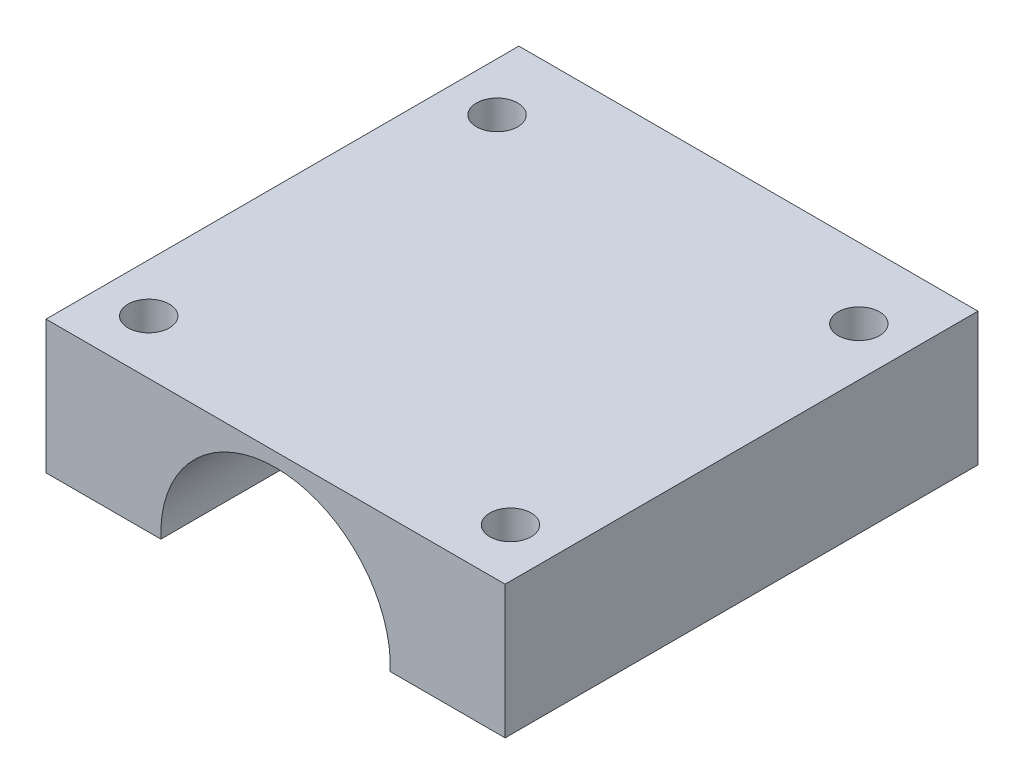
ISO-10303-21;
HEADER;
FILE_DESCRIPTION(('STEP AP214'),'2;1');
FILE_NAME('part.step','',(''),(''),'','','');
FILE_SCHEMA(('AUTOMOTIVE_DESIGN { 1 0 10303 214 1 1 1 1 }'));
ENDSEC;
DATA;
#1=APPLICATION_CONTEXT('core data for automotive mechanical design processes');
#2=APPLICATION_PROTOCOL_DEFINITION('international standard','automotive_design',2000,#1);
#3=PRODUCT_CONTEXT('',#1,'mechanical');
#4=PRODUCT('Part','Part','',(#3));
#5=PRODUCT_RELATED_PRODUCT_CATEGORY('part','',(#4));
#6=PRODUCT_DEFINITION_FORMATION('','',#4);
#7=PRODUCT_DEFINITION_CONTEXT('part definition',#1,'design');
#8=PRODUCT_DEFINITION('design','',#6,#7);
#9=PRODUCT_DEFINITION_SHAPE('','',#8);
#10=(LENGTH_UNIT() NAMED_UNIT(*) SI_UNIT(.MILLI.,.METRE.));
#11=(NAMED_UNIT(*) PLANE_ANGLE_UNIT() SI_UNIT($,.RADIAN.));
#12=(NAMED_UNIT(*) SI_UNIT($,.STERADIAN.) SOLID_ANGLE_UNIT());
#13=UNCERTAINTY_MEASURE_WITH_UNIT(LENGTH_MEASURE(1.E-05),#10,'distance_accuracy_value','');
#14=(GEOMETRIC_REPRESENTATION_CONTEXT(3) GLOBAL_UNCERTAINTY_ASSIGNED_CONTEXT((#13)) GLOBAL_UNIT_ASSIGNED_CONTEXT((#10,
#11,#12)) REPRESENTATION_CONTEXT('',''));
#15=CARTESIAN_POINT('',(0.,0.,0.));
#16=DIRECTION('',(0.,0.,1.));
#17=DIRECTION('',(1.,0.,0.));
#18=AXIS2_PLACEMENT_3D('',#15,#16,#17);
#19=CARTESIAN_POINT('',(0.,-0.500000000000001,0.));
#20=DIRECTION('',(0.,1.,0.));
#21=DIRECTION('',(0.,0.,1.));
#22=AXIS2_PLACEMENT_3D('',#19,#20,#21);
#23=PLANE('',#22);
#24=DIRECTION('',(0.,0.,1.));
#25=VECTOR('',#24,1.);
#26=CARTESIAN_POINT('',(-3.71651718682963,-0.500000000000001,-1.5));
#27=LINE('',#26,#25);
#28=CARTESIAN_POINT('',(-3.71651718682963,-0.500000000000001,-1.5));
#29=VERTEX_POINT('',#28);
#30=CARTESIAN_POINT('',(-3.71651718682963,-0.500000000000001,0.));
#31=VERTEX_POINT('',#30);
#32=EDGE_CURVE('E291',#29,#31,#27,.T.);
#33=ORIENTED_EDGE('',*,*,#32,.T.);
#34=DIRECTION('',(-1.,0.,0.));
#35=VECTOR('',#34,1.);
#36=CARTESIAN_POINT('',(0.,-0.500000000000001,0.));
#37=LINE('',#36,#35);
#38=CARTESIAN_POINT('',(-6.87519231907282,-0.500000000000001,0.));
#39=VERTEX_POINT('',#38);
#40=EDGE_CURVE('E324',#31,#39,#37,.T.);
#41=ORIENTED_EDGE('',*,*,#40,.T.);
#42=DIRECTION('',(0.,0.,-1.));
#43=VECTOR('',#42,1.);
#44=CARTESIAN_POINT('',(-6.87519231907282,-0.500000000000001,-1.5));
#45=LINE('',#44,#43);
#46=CARTESIAN_POINT('',(-6.87519231907282,-0.500000000000001,-0.0499999999999932));
#47=VERTEX_POINT('',#46);
#48=EDGE_CURVE('E283',#47,#39,#45,.F.);
#49=ORIENTED_EDGE('',*,*,#48,.F.);
#50=CARTESIAN_POINT('',(-5.38922670546374,-0.500000000000001,-1.5007));
#51=CARTESIAN_POINT('',(-5.47847927084528,-0.500000000000001,-1.41258268684375));
#52=CARTESIAN_POINT('',(-5.56777555108285,-0.500000000000001,-1.32450958142149));
#53=CARTESIAN_POINT('',(-5.7465567691382,-0.500000000000001,-1.14842874730177));
#54=CARTESIAN_POINT('',(-5.8360417956408,-0.500000000000001,-1.06042110866229));
#55=CARTESIAN_POINT('',(-6.01634200826261,-0.500000000000001,-0.883427900472544));
#56=CARTESIAN_POINT('',(-6.10715934317078,-0.500000000000001,-0.794444517814048));
#57=CARTESIAN_POINT('',(-6.28896658305993,-0.500000000000001,-0.616782123823329));
#58=CARTESIAN_POINT('',(-6.37995632231203,-0.500000000000001,-0.528102942775778));
#59=CARTESIAN_POINT('',(-6.60212243119227,-0.500000000000001,-0.312377836950901));
#60=CARTESIAN_POINT('',(-6.73347357120777,-0.500000000000001,-0.185511133524346));
#61=CARTESIAN_POINT('',(-6.93161704775093,-0.500000000000001,0.00395585415796175));
#62=CARTESIAN_POINT('',(-6.99793523931582,-0.500000000000001,0.0670516174259814));
#63=CARTESIAN_POINT('',(-7.13101886009611,-0.500000000000001,0.192733823428584));
#64=CARTESIAN_POINT('',(-7.19778415949347,-0.500000000000001,0.255320403231186));
#65=CARTESIAN_POINT('',(-7.33131284468334,-0.500000000000001,0.37909119414557));
#66=CARTESIAN_POINT('',(-7.39806897615554,-0.500000000000001,0.440283224264801));
#67=CARTESIAN_POINT('',(-7.53273160091706,-0.500000000000001,0.561546590699582));
#68=CARTESIAN_POINT('',(-7.60063924082482,-0.500000000000001,0.621616667544609));
#69=CARTESIAN_POINT('',(-7.70375302953429,-0.500000000000001,0.709944472184019));
#70=CARTESIAN_POINT('',(-7.73825189096697,-0.500000000000001,0.739025713796864));
#71=CARTESIAN_POINT('',(-7.80789160851985,-0.500000000000001,0.79640671192015));
#72=CARTESIAN_POINT('',(-7.84303239337594,-0.500000000000001,0.824706554313211));
#73=CARTESIAN_POINT('',(-7.91414908366871,-0.500000000000001,0.880113869103118));
#74=CARTESIAN_POINT('',(-7.95012346769481,-0.500000000000001,0.907223286913179));
#75=CARTESIAN_POINT('',(-8.02333412722306,-0.500000000000001,0.959671932878594));
#76=CARTESIAN_POINT('',(-8.060569500165,-0.500000000000001,0.985012389006578));
#77=CARTESIAN_POINT('',(-8.10782476112611,-0.500000000000001,1.01458499857289));
#78=CARTESIAN_POINT('',(-8.1169806942485,-0.500000000000001,1.02019876918069));
#79=CARTESIAN_POINT('',(-8.13540952973909,-0.500000000000001,1.03123390135718));
#80=CARTESIAN_POINT('',(-8.14468244901387,-0.500000000000001,1.03665523467332));
#81=CARTESIAN_POINT('',(-8.17269002648916,-0.500000000000001,1.05259249932407));
#82=CARTESIAN_POINT('',(-8.19161323965308,-0.500000000000001,1.06278152787728));
#83=CARTESIAN_POINT('',(-8.22987811167886,-0.500000000000001,1.08193831860371));
#84=CARTESIAN_POINT('',(-8.2492149613085,-0.500000000000001,1.09091556198756));
#85=CARTESIAN_POINT('',(-8.28850349303215,-0.500000000000001,1.10740198592549));
#86=CARTESIAN_POINT('',(-8.30845503291183,-0.500000000000001,1.11491150314265));
#87=CARTESIAN_POINT('',(-8.35773867967598,-0.500000000000001,1.13087791263133));
#88=CARTESIAN_POINT('',(-8.38740879647834,-0.500000000000001,1.13834899898805));
#89=CARTESIAN_POINT('',(-8.4475355978484,-0.500000000000001,1.14812088531787));
#90=CARTESIAN_POINT('',(-8.47798932895234,-0.500000000000001,1.15043884646649));
#91=CARTESIAN_POINT('',(-8.53886058349151,-0.500000000000001,1.14941920796732));
#92=CARTESIAN_POINT('',(-8.5692778979401,-0.500000000000001,1.14606976810795));
#93=CARTESIAN_POINT('',(-8.62919714185962,-0.500000000000001,1.13442433299227));
#94=CARTESIAN_POINT('',(-8.65869558573092,-0.500000000000001,1.12611146315552));
#95=CARTESIAN_POINT('',(-8.7204442212633,-0.500000000000001,1.10443479541082));
#96=CARTESIAN_POINT('',(-8.7524944145643,-0.500000000000001,1.09052333958103));
#97=CARTESIAN_POINT('',(-8.81510060284621,-0.500000000000001,1.05962271352269));
#98=CARTESIAN_POINT('',(-8.84565335933274,-0.500000000000001,1.04262721686606));
#99=CARTESIAN_POINT('',(-8.90578512666185,-0.500000000000001,1.00650916848476));
#100=CARTESIAN_POINT('',(-8.93535445067873,-0.500000000000001,0.98737076234136));
#101=CARTESIAN_POINT('',(-8.99353840037014,-0.500000000000001,0.947769566969732));
#102=CARTESIAN_POINT('',(-9.0221539354223,-0.500000000000001,0.927308097315916));
#103=CARTESIAN_POINT('',(-9.08156046183026,-0.500000000000001,0.883335760162311));
#104=CARTESIAN_POINT('',(-9.11227781740902,-0.500000000000001,0.85972606872196));
#105=CARTESIAN_POINT('',(-9.1730948502689,-0.500000000000001,0.811721538809686));
#106=CARTESIAN_POINT('',(-9.20319444955723,-0.500000000000001,0.787326602185665));
#107=CARTESIAN_POINT('',(-9.29282928586623,-0.500000000000001,0.713287328203711));
#108=CARTESIAN_POINT('',(-9.3516736339897,-0.500000000000001,0.662809132750884));
#109=CARTESIAN_POINT('',(-9.46836027389012,-0.500000000000001,0.560529249900519));
#110=CARTESIAN_POINT('',(-9.52620073706399,-0.500000000000001,0.50872550167204));
#111=CARTESIAN_POINT('',(-9.64115305259559,-0.500000000000001,0.404347090839906));
#112=CARTESIAN_POINT('',(-9.69826509247083,-0.500000000000001,0.351772634448371));
#113=CARTESIAN_POINT('',(-9.81179063483446,-0.500000000000001,0.24630587664825));
#114=CARTESIAN_POINT('',(-9.86820596480429,-0.500000000000001,0.193415536103337));
#115=CARTESIAN_POINT('',(-9.98069903084663,-0.500000000000001,0.0872700260744862));
#116=CARTESIAN_POINT('',(-10.036776744384,-0.500000000000001,0.0340148327337781));
#117=CARTESIAN_POINT('',(-10.2045431671155,-0.500000000000001,-0.126044011043694));
#118=CARTESIAN_POINT('',(-10.3158637046181,-0.500000000000001,-0.233233225579581));
#119=CARTESIAN_POINT('',(-10.5260818813483,-0.500000000000001,-0.436720609821966));
#120=CARTESIAN_POINT('',(-10.6250368922359,-0.500000000000001,-0.532959692408414));
#121=CARTESIAN_POINT('',(-10.8226683334927,-0.500000000000001,-0.72577716887962));
#122=CARTESIAN_POINT('',(-10.9213446807132,-0.500000000000001,-0.822355647983203));
#123=CARTESIAN_POINT('',(-11.1185808983605,-0.500000000000001,-1.01582008289757));
#124=CARTESIAN_POINT('',(-11.2171405666185,-0.500000000000001,-1.11270624464374));
#125=CARTESIAN_POINT('',(-11.4140750542471,-0.500000000000001,-1.30661096625877));
#126=CARTESIAN_POINT('',(-11.5124499177883,-0.500000000000001,-1.40362948125847));
#127=CARTESIAN_POINT('',(-11.6107732945363,-0.500000000000001,-1.5007));
#128=B_SPLINE_CURVE_WITH_KNOTS('',3,(#50,#51,#52,#53,#54,#55,#56,#57,#58,#59,#60,#61,#62,#63,
#64,#65,#66,#67,#68,#69,#70,#71,#72,#73,#74,#75,#76,#77,#78,#79,#80,#81,#82,#83,#84,#85,#86,#87,
#88,#89,#90,#91,#92,#93,#94,#95,#96,#97,#98,#99,#100,#101,#102,#103,#104,#105,#106,#107,#108,
#109,#110,#111,#112,#113,#114,#115,#116,#117,#118,#119,#120,#121,#122,#123,#124,#125,#126,#127),
.UNSPECIFIED.,.F.,.F.,(4,2,2,2,2,2,2,2,2,2,2,2,2,2,2,2,2,2,2,2,2,2,2,2,2,2,2,2,2,2,2,2,2,2,2,2,
2,2,4),(0.,0.376266083400724,0.752797816982333,1.13423212617476,1.51539888519738,
2.06323784813492,2.33784998470154,2.61238557454853,2.88405554375817,3.15601408700058,
3.29136946520175,3.42670990696061,3.56182024888399,3.69683584793786,3.72905348280828,
3.7612758282884,3.82572145809787,3.88962933224232,3.95352253012226,4.0449438559842,
4.13606026734403,4.22736727226528,4.31898648293016,4.42354924896768,4.52832898510656,
4.63394276355624,4.73945278471841,4.85566161682352,4.9718850313482,5.20443350376504,
5.43736859658582,5.67024246295748,5.90223339727793,6.13423964847816,6.59784710680747,
7.01195578251824,7.42617716261264,7.84079539711024,8.25529709047937),.UNSPECIFIED.);
#129=CARTESIAN_POINT('',(-5.3899356919832,-0.500000000000001,-1.5));
#130=VERTEX_POINT('',#129);
#131=EDGE_CURVE('E269',#130,#47,#128,.T.);
#132=ORIENTED_EDGE('',*,*,#131,.F.);
#133=DIRECTION('',(-1.,0.,0.));
#134=VECTOR('',#133,1.);
#135=CARTESIAN_POINT('',(0.,-0.500000000000001,-1.5));
#136=LINE('',#135,#134);
#137=EDGE_CURVE('E378',#29,#130,#136,.T.);
#138=ORIENTED_EDGE('',*,*,#137,.F.);
#139=EDGE_LOOP('',(#33,#41,#49,#132,#138));
#140=FACE_BOUND('',#139,.T.);
#141=ADVANCED_FACE('F43',(#140),#23,.F.);
#142=CARTESIAN_POINT('',(-19.6986749407734,-0.5,6.17682172326088));
#143=DIRECTION('',(0.,1.,0.));
#144=DIRECTION('',(0.,0.,1.));
#145=AXIS2_PLACEMENT_3D('',#142,#143,#144);
#146=CIRCLE('',#145,2.25);
#147=CARTESIAN_POINT('',(-19.6986749407734,-0.5,8.42682172326087));
#148=VERTEX_POINT('',#147);
#149=EDGE_CURVE('E299',#148,#148,#146,.F.);
#150=ORIENTED_EDGE('',*,*,#149,.F.);
#151=EDGE_LOOP('',(#150));
#152=FACE_BOUND('',#151,.T.);
#153=DIRECTION('',(-1.,0.,0.));
#154=VECTOR('',#153,1.);
#155=CARTESIAN_POINT('',(0.,-0.500000000000001,50.));
#156=LINE('',#155,#154);
#157=CARTESIAN_POINT('',(-12.4899959967968,-0.500000000000001,50.));
#158=VERTEX_POINT('',#157);
#159=CARTESIAN_POINT('',(-25.,-0.500000000000001,50.));
#160=VERTEX_POINT('',#159);
#161=EDGE_CURVE('E279',#158,#160,#156,.T.);
#162=ORIENTED_EDGE('',*,*,#161,.T.);
#163=DIRECTION('',(0.,0.,-1.));
#164=VECTOR('',#163,1.);
#165=CARTESIAN_POINT('',(-25.,-0.500000000000001,50.));
#166=LINE('',#165,#164);
#167=CARTESIAN_POINT('',(-25.,-0.500000000000001,-1.5));
#168=VERTEX_POINT('',#167);
#169=EDGE_CURVE('E11',#160,#168,#166,.T.);
#170=ORIENTED_EDGE('',*,*,#169,.T.);
#171=CARTESIAN_POINT('',(-11.6100643080168,-0.500000000000001,-1.5));
#172=VERTEX_POINT('',#171);
#173=EDGE_CURVE('E62',#172,#168,#136,.T.);
#174=ORIENTED_EDGE('',*,*,#173,.F.);
#175=CARTESIAN_POINT('',(-10.1248076809272,-0.500000000000001,-0.0499999999999932));
#176=VERTEX_POINT('',#175);
#177=EDGE_CURVE('E278',#176,#172,#128,.T.);
#178=ORIENTED_EDGE('',*,*,#177,.F.);
#179=DIRECTION('',(0.,0.,-1.));
#180=VECTOR('',#179,1.);
#181=CARTESIAN_POINT('',(-10.1248076809272,-0.500000000000001,-1.5));
#182=LINE('',#181,#180);
#183=CARTESIAN_POINT('',(-10.1248076809272,-0.500000000000001,0.));
#184=VERTEX_POINT('',#183);
#185=EDGE_CURVE('E277',#184,#176,#182,.T.);
#186=ORIENTED_EDGE('',*,*,#185,.F.);
#187=CARTESIAN_POINT('',(-12.4899959967968,-0.500000000000001,0.));
#188=VERTEX_POINT('',#187);
#189=EDGE_CURVE('E295',#184,#188,#37,.T.);
#190=ORIENTED_EDGE('',*,*,#189,.T.);
#191=DIRECTION('',(0.,0.,-1.));
#192=VECTOR('',#191,1.);
#193=CARTESIAN_POINT('',(-12.4899959967968,-0.500000000000001,50.));
#194=LINE('',#193,#192);
#195=EDGE_CURVE('E284',#188,#158,#194,.F.);
#196=ORIENTED_EDGE('',*,*,#195,.T.);
#197=EDGE_LOOP('',(#162,#170,#174,#178,#186,#190,#196));
#198=FACE_BOUND('',#197,.T.);
#199=CARTESIAN_POINT('',(-19.6986749407734,-0.5,44.1150104980837));
#200=DIRECTION('',(0.,1.,0.));
#201=DIRECTION('',(0.,0.,1.));
#202=AXIS2_PLACEMENT_3D('',#199,#200,#201);
#203=CIRCLE('',#202,2.25);
#204=CARTESIAN_POINT('',(-19.6986749407734,-0.5,46.3650104980837));
#205=VERTEX_POINT('',#204);
#206=EDGE_CURVE('E302',#205,#205,#203,.F.);
#207=ORIENTED_EDGE('',*,*,#206,.F.);
#208=EDGE_LOOP('',(#207));
#209=FACE_BOUND('',#208,.T.);
#210=ADVANCED_FACE('F389',(#152,#198,#209),#23,.F.);
#211=CARTESIAN_POINT('',(19.6986749407734,-0.5,6.17682172326088));
#212=DIRECTION('',(0.,1.,0.));
#213=DIRECTION('',(0.,0.,1.));
#214=AXIS2_PLACEMENT_3D('',#211,#212,#213);
#215=CIRCLE('',#214,2.25);
#216=CARTESIAN_POINT('',(19.6986749407734,-0.5,8.42682172326087));
#217=VERTEX_POINT('',#216);
#218=EDGE_CURVE('E172',#217,#217,#215,.F.);
#219=ORIENTED_EDGE('',*,*,#218,.F.);
#220=EDGE_LOOP('',(#219));
#221=FACE_BOUND('',#220,.T.);
#222=CARTESIAN_POINT('',(25.,-0.499999999999995,50.));
#223=VERTEX_POINT('',#222);
#224=CARTESIAN_POINT('',(12.4899959967968,-0.500000000000001,50.));
#225=VERTEX_POINT('',#224);
#226=EDGE_CURVE('E287',#223,#225,#156,.T.);
#227=ORIENTED_EDGE('',*,*,#226,.T.);
#228=DIRECTION('',(0.,0.,-1.));
#229=VECTOR('',#228,1.);
#230=CARTESIAN_POINT('',(12.4899959967968,-0.500000000000001,50.));
#231=LINE('',#230,#229);
#232=CARTESIAN_POINT('',(12.4899959967968,-0.500000000000001,0.));
#233=VERTEX_POINT('',#232);
#234=EDGE_CURVE('E288',#225,#233,#231,.T.);
#235=ORIENTED_EDGE('',*,*,#234,.T.);
#236=CARTESIAN_POINT('',(10.1248076809272,-0.500000000000001,0.));
#237=VERTEX_POINT('',#236);
#238=EDGE_CURVE('E325',#233,#237,#37,.T.);
#239=ORIENTED_EDGE('',*,*,#238,.T.);
#240=DIRECTION('',(0.,0.,-1.));
#241=VECTOR('',#240,1.);
#242=CARTESIAN_POINT('',(10.1248076809272,-0.500000000000001,-1.5));
#243=LINE('',#242,#241);
#244=CARTESIAN_POINT('',(10.1248076809272,-0.500000000000001,-0.0499999999999932));
#245=VERTEX_POINT('',#244);
#246=EDGE_CURVE('E316',#245,#237,#243,.F.);
#247=ORIENTED_EDGE('',*,*,#246,.F.);
#248=CARTESIAN_POINT('',(11.6107732945363,-0.500000000000001,-1.5007));
#249=CARTESIAN_POINT('',(11.5215207291547,-0.500000000000001,-1.41258268684375));
#250=CARTESIAN_POINT('',(11.4322244489172,-0.500000000000001,-1.32450958142149));
#251=CARTESIAN_POINT('',(11.2534432308618,-0.500000000000001,-1.14842874730178));
#252=CARTESIAN_POINT('',(11.1639582043592,-0.500000000000001,-1.06042110866229));
#253=CARTESIAN_POINT('',(10.9836579917374,-0.500000000000001,-0.883427900472545));
#254=CARTESIAN_POINT('',(10.8928406568292,-0.500000000000001,-0.794444517814049));
#255=CARTESIAN_POINT('',(10.7110334169401,-0.500000000000001,-0.61678212382333));
#256=CARTESIAN_POINT('',(10.620043677688,-0.500000000000001,-0.528102942775779));
#257=CARTESIAN_POINT('',(10.3978775688077,-0.500000000000001,-0.312377836950902));
#258=CARTESIAN_POINT('',(10.2665264287922,-0.500000000000001,-0.185511133524348));
#259=CARTESIAN_POINT('',(10.0683829522491,-0.500000000000001,0.00395585415796061));
#260=CARTESIAN_POINT('',(10.0020647606842,-0.500000000000001,0.0670516174259805));
#261=CARTESIAN_POINT('',(9.8689811399039,-0.500000000000001,0.192733823428583));
#262=CARTESIAN_POINT('',(9.80221584050653,-0.500000000000001,0.255320403231184));
#263=CARTESIAN_POINT('',(9.66868715531666,-0.500000000000001,0.379091194145568));
#264=CARTESIAN_POINT('',(9.60193102384446,-0.500000000000001,0.440283224264799));
#265=CARTESIAN_POINT('',(9.46726839908294,-0.500000000000001,0.561546590699581));
#266=CARTESIAN_POINT('',(9.39936075917518,-0.500000000000001,0.621616667544608));
#267=CARTESIAN_POINT('',(9.29624697046572,-0.500000000000001,0.709944472184019));
#268=CARTESIAN_POINT('',(9.26174810903303,-0.500000000000001,0.739025713796863));
#269=CARTESIAN_POINT('',(9.19210839148015,-0.500000000000001,0.79640671192015));
#270=CARTESIAN_POINT('',(9.15696760662406,-0.500000000000001,0.824706554313211));
#271=CARTESIAN_POINT('',(9.08585091633129,-0.500000000000001,0.880113869103118));
#272=CARTESIAN_POINT('',(9.04987653230519,-0.500000000000001,0.907223286913179));
#273=CARTESIAN_POINT('',(8.97666587277694,-0.500000000000001,0.959671932878594));
#274=CARTESIAN_POINT('',(8.939430499835,-0.500000000000001,0.985012389006578));
#275=CARTESIAN_POINT('',(8.89217523887389,-0.500000000000001,1.01458499857289));
#276=CARTESIAN_POINT('',(8.8830193057515,-0.500000000000001,1.02019876918069));
#277=CARTESIAN_POINT('',(8.86459047026091,-0.500000000000001,1.03123390135718));
#278=CARTESIAN_POINT('',(8.85531755098613,-0.500000000000001,1.03665523467332));
#279=CARTESIAN_POINT('',(8.82730997351084,-0.500000000000001,1.05259249932407));
#280=CARTESIAN_POINT('',(8.80838676034692,-0.500000000000001,1.06278152787728));
#281=CARTESIAN_POINT('',(8.77012188832114,-0.500000000000001,1.08193831860371));
#282=CARTESIAN_POINT('',(8.75078503869151,-0.500000000000001,1.09091556198756));
#283=CARTESIAN_POINT('',(8.71149650696785,-0.500000000000001,1.10740198592549));
#284=CARTESIAN_POINT('',(8.69154496708817,-0.500000000000001,1.11491150314265));
#285=CARTESIAN_POINT('',(8.64226132032403,-0.500000000000001,1.13087791263133));
#286=CARTESIAN_POINT('',(8.61259120352166,-0.500000000000001,1.13834899898805));
#287=CARTESIAN_POINT('',(8.5524644021516,-0.500000000000001,1.14812088531787));
#288=CARTESIAN_POINT('',(8.52201067104766,-0.500000000000001,1.15043884646649));
#289=CARTESIAN_POINT('',(8.46113941650849,-0.500000000000001,1.14941920796732));
#290=CARTESIAN_POINT('',(8.4307221020599,-0.500000000000001,1.14606976810795));
#291=CARTESIAN_POINT('',(8.37080285814038,-0.500000000000001,1.13442433299227));
#292=CARTESIAN_POINT('',(8.34130441426909,-0.500000000000001,1.12611146315552));
#293=CARTESIAN_POINT('',(8.2795557787367,-0.500000000000001,1.10443479541082));
#294=CARTESIAN_POINT('',(8.2475055854357,-0.500000000000001,1.09052333958103));
#295=CARTESIAN_POINT('',(8.18489939715379,-0.500000000000001,1.05962271352269));
#296=CARTESIAN_POINT('',(8.15434664066727,-0.500000000000001,1.04262721686606));
#297=CARTESIAN_POINT('',(8.09421487333815,-0.500000000000001,1.00650916848476));
#298=CARTESIAN_POINT('',(8.06464554932127,-0.500000000000001,0.987370762341361));
#299=CARTESIAN_POINT('',(8.00646159962986,-0.500000000000001,0.947769566969733));
#300=CARTESIAN_POINT('',(7.9778460645777,-0.500000000000001,0.927308097315916));
#301=CARTESIAN_POINT('',(7.91843953816974,-0.500000000000001,0.883335760162311));
#302=CARTESIAN_POINT('',(7.88772218259098,-0.500000000000001,0.859726068721961));
#303=CARTESIAN_POINT('',(7.8269051497311,-0.500000000000001,0.811721538809688));
#304=CARTESIAN_POINT('',(7.79680555044278,-0.500000000000001,0.787326602185666));
#305=CARTESIAN_POINT('',(7.70717071413377,-0.500000000000001,0.713287328203712));
#306=CARTESIAN_POINT('',(7.6483263660103,-0.500000000000001,0.662809132750885));
#307=CARTESIAN_POINT('',(7.53163972610988,-0.500000000000001,0.56052924990052));
#308=CARTESIAN_POINT('',(7.47379926293601,-0.500000000000001,0.508725501672041));
#309=CARTESIAN_POINT('',(7.35884694740441,-0.500000000000001,0.404347090839906));
#310=CARTESIAN_POINT('',(7.30173490752917,-0.500000000000001,0.351772634448371));
#311=CARTESIAN_POINT('',(7.18820936516554,-0.500000000000001,0.24630587664825));
#312=CARTESIAN_POINT('',(7.13179403519571,-0.500000000000001,0.193415536103337));
#313=CARTESIAN_POINT('',(7.01930096915337,-0.500000000000001,0.0872700260744855));
#314=CARTESIAN_POINT('',(6.96322325561595,-0.500000000000001,0.0340148327337778));
#315=CARTESIAN_POINT('',(6.79545683288447,-0.500000000000001,-0.126044011043694));
#316=CARTESIAN_POINT('',(6.68413629538186,-0.500000000000001,-0.233233225579581));
#317=CARTESIAN_POINT('',(6.47391811865172,-0.500000000000001,-0.436720609821967));
#318=CARTESIAN_POINT('',(6.37496310776409,-0.500000000000001,-0.532959692408414));
#319=CARTESIAN_POINT('',(6.17733166650731,-0.500000000000001,-0.725777168879621));
#320=CARTESIAN_POINT('',(6.0786553192868,-0.500000000000001,-0.822355647983204));
#321=CARTESIAN_POINT('',(5.88141910163955,-0.500000000000001,-1.01582008289756));
#322=CARTESIAN_POINT('',(5.78285943338155,-0.500000000000001,-1.11270624464374));
#323=CARTESIAN_POINT('',(5.58592494575293,-0.500000000000001,-1.30661096625877));
#324=CARTESIAN_POINT('',(5.48755008221173,-0.500000000000001,-1.40362948125847));
#325=CARTESIAN_POINT('',(5.38922670546374,-0.500000000000001,-1.5007));
#326=B_SPLINE_CURVE_WITH_KNOTS('',3,(#248,#249,#250,#251,#252,#253,#254,#255,#256,#257,#258,
#259,#260,#261,#262,#263,#264,#265,#266,#267,#268,#269,#270,#271,#272,#273,#274,#275,#276,#277,
#278,#279,#280,#281,#282,#283,#284,#285,#286,#287,#288,#289,#290,#291,#292,#293,#294,#295,#296,
#297,#298,#299,#300,#301,#302,#303,#304,#305,#306,#307,#308,#309,#310,#311,#312,#313,#314,#315,
#316,#317,#318,#319,#320,#321,#322,#323,#324,#325),.UNSPECIFIED.,.F.,.F.,(4,2,2,2,2,2,2,2,2,2,2,
2,2,2,2,2,2,2,2,2,2,2,2,2,2,2,2,2,2,2,2,2,2,2,2,2,2,2,4),(0.,0.376266083400723,
0.752797816982332,1.13423212617476,1.51539888519738,2.06323784813492,2.33784998470154,
2.61238557454853,2.88405554375817,3.15601408700058,3.29136946520175,3.42670990696061,
3.56182024888399,3.69683584793786,3.72905348280829,3.7612758282884,3.82572145809787,
3.88962933224232,3.95352253012226,4.04494385598419,4.13606026734403,4.22736727226528,
4.31898648293016,4.42354924896769,4.52832898510655,4.63394276355624,4.73945278471841,
4.85566161682352,4.9718850313482,5.20443350376504,5.43736859658582,5.67024246295748,
5.90223339727794,6.13423964847816,6.59784710680747,7.01195578251825,7.42617716261264,
7.84079539711024,8.25529709047937),.UNSPECIFIED.);
#327=CARTESIAN_POINT('',(11.6100643080168,-0.500000000000001,-1.5));
#328=VERTEX_POINT('',#327);
#329=EDGE_CURVE('E168',#328,#245,#326,.T.);
#330=ORIENTED_EDGE('',*,*,#329,.F.);
#331=CARTESIAN_POINT('',(25.,-0.499999999999995,-1.5));
#332=VERTEX_POINT('',#331);
#333=EDGE_CURVE('E164',#332,#328,#136,.T.);
#334=ORIENTED_EDGE('',*,*,#333,.F.);
#335=DIRECTION('',(0.,0.,-1.));
#336=VECTOR('',#335,1.);
#337=CARTESIAN_POINT('',(25.,-0.499999999999995,50.));
#338=LINE('',#337,#336);
#339=EDGE_CURVE('E149',#223,#332,#338,.T.);
#340=ORIENTED_EDGE('',*,*,#339,.F.);
#341=EDGE_LOOP('',(#227,#235,#239,#247,#330,#334,#340));
#342=FACE_BOUND('',#341,.T.);
#343=CARTESIAN_POINT('',(19.6986749407734,-0.5,44.1150104980837));
#344=DIRECTION('',(0.,1.,0.));
#345=DIRECTION('',(0.,0.,1.));
#346=AXIS2_PLACEMENT_3D('',#343,#344,#345);
#347=CIRCLE('',#346,2.25);
#348=CARTESIAN_POINT('',(19.6986749407734,-0.5,46.3650104980837));
#349=VERTEX_POINT('',#348);
#350=EDGE_CURVE('E48',#349,#349,#347,.F.);
#351=ORIENTED_EDGE('',*,*,#350,.F.);
#352=EDGE_LOOP('',(#351));
#353=FACE_BOUND('',#352,.T.);
#354=ADVANCED_FACE('F165',(#221,#342,#353),#23,.F.);
#355=DIRECTION('',(0.,0.,1.));
#356=VECTOR('',#355,1.);
#357=CARTESIAN_POINT('',(3.71651718682963,-0.500000000000001,-1.5));
#358=LINE('',#357,#356);
#359=CARTESIAN_POINT('',(3.71651718682963,-0.500000000000001,0.));
#360=VERTEX_POINT('',#359);
#361=CARTESIAN_POINT('',(3.71651718682963,-0.500000000000001,-1.5));
#362=VERTEX_POINT('',#361);
#363=EDGE_CURVE('E54',#360,#362,#358,.F.);
#364=ORIENTED_EDGE('',*,*,#363,.T.);
#365=CARTESIAN_POINT('',(5.3899356919832,-0.500000000000001,-1.5));
#366=VERTEX_POINT('',#365);
#367=EDGE_CURVE('E173',#366,#362,#136,.T.);
#368=ORIENTED_EDGE('',*,*,#367,.F.);
#369=CARTESIAN_POINT('',(6.87519231907282,-0.500000000000001,-0.0499999999999932));
#370=VERTEX_POINT('',#369);
#371=EDGE_CURVE('E230',#370,#366,#326,.T.);
#372=ORIENTED_EDGE('',*,*,#371,.F.);
#373=DIRECTION('',(0.,0.,-1.));
#374=VECTOR('',#373,1.);
#375=CARTESIAN_POINT('',(6.87519231907282,-0.500000000000001,-1.5));
#376=LINE('',#375,#374);
#377=CARTESIAN_POINT('',(6.87519231907282,-0.500000000000001,0.));
#378=VERTEX_POINT('',#377);
#379=EDGE_CURVE('E249',#378,#370,#376,.T.);
#380=ORIENTED_EDGE('',*,*,#379,.F.);
#381=EDGE_CURVE('E330',#378,#360,#37,.T.);
#382=ORIENTED_EDGE('',*,*,#381,.T.);
#383=EDGE_LOOP('',(#364,#368,#372,#380,#382));
#384=FACE_BOUND('',#383,.T.);
#385=ADVANCED_FACE('F45',(#384),#23,.F.);
#386=CARTESIAN_POINT('',(0.,0.,50.));
#387=DIRECTION('',(0.,0.,-1.));
#388=DIRECTION('',(-1.,0.,0.));
#389=AXIS2_PLACEMENT_3D('',#386,#387,#388);
#390=CYLINDRICAL_SURFACE('',#389,12.5);
#391=ORIENTED_EDGE('',*,*,#234,.F.);
#392=CARTESIAN_POINT('',(0.,0.,50.));
#393=DIRECTION('',(0.,0.,1.));
#394=DIRECTION('',(1.,0.,0.));
#395=AXIS2_PLACEMENT_3D('',#392,#393,#394);
#396=CIRCLE('',#395,12.5);
#397=EDGE_CURVE('E219',#225,#158,#396,.T.);
#398=ORIENTED_EDGE('',*,*,#397,.T.);
#399=ORIENTED_EDGE('',*,*,#195,.F.);
#400=CARTESIAN_POINT('',(0.,0.,0.));
#401=DIRECTION('',(0.,0.,1.));
#402=DIRECTION('',(1.,0.,0.));
#403=AXIS2_PLACEMENT_3D('',#400,#401,#402);
#404=CIRCLE('',#403,12.5);
#405=EDGE_CURVE('E209',#233,#188,#404,.T.);
#406=ORIENTED_EDGE('',*,*,#405,.F.);
#407=EDGE_LOOP('',(#391,#398,#399,#406));
#408=FACE_BOUND('',#407,.T.);
#409=ADVANCED_FACE('F342',(#408),#390,.F.);
#410=CARTESIAN_POINT('',(0.,14.,50.));
#411=DIRECTION('',(0.,1.,0.));
#412=DIRECTION('',(0.,0.,1.));
#413=AXIS2_PLACEMENT_3D('',#410,#411,#412);
#414=PLANE('',#413);
#415=CARTESIAN_POINT('',(19.6986749407734,14.,6.17682172326088));
#416=DIRECTION('',(0.,-1.,0.));
#417=DIRECTION('',(0.,0.,-1.));
#418=AXIS2_PLACEMENT_3D('',#415,#416,#417);
#419=CIRCLE('',#418,2.24999999999999);
#420=CARTESIAN_POINT('',(19.6986749407734,14.,3.92682172326089));
#421=VERTEX_POINT('',#420);
#422=EDGE_CURVE('E193',#421,#421,#419,.T.);
#423=ORIENTED_EDGE('',*,*,#422,.T.);
#424=EDGE_LOOP('',(#423));
#425=FACE_BOUND('',#424,.T.);
#426=CARTESIAN_POINT('',(-19.6986749407734,14.,6.17682172326088));
#427=DIRECTION('',(0.,-1.,0.));
#428=DIRECTION('',(0.,0.,-1.));
#429=AXIS2_PLACEMENT_3D('',#426,#427,#428);
#430=CIRCLE('',#429,2.24999999999999);
#431=CARTESIAN_POINT('',(-19.6986749407734,14.,3.92682172326089));
#432=VERTEX_POINT('',#431);
#433=EDGE_CURVE('E197',#432,#432,#430,.T.);
#434=ORIENTED_EDGE('',*,*,#433,.T.);
#435=EDGE_LOOP('',(#434));
#436=FACE_BOUND('',#435,.T.);
#437=CARTESIAN_POINT('',(-19.6986749407734,14.,44.1150104980837));
#438=DIRECTION('',(0.,-1.,0.));
#439=DIRECTION('',(0.,0.,-1.));
#440=AXIS2_PLACEMENT_3D('',#437,#438,#439);
#441=CIRCLE('',#440,2.24999999999999);
#442=CARTESIAN_POINT('',(-19.6986749407734,14.,41.8650104980837));
#443=VERTEX_POINT('',#442);
#444=EDGE_CURVE('E201',#443,#443,#441,.T.);
#445=ORIENTED_EDGE('',*,*,#444,.T.);
#446=EDGE_LOOP('',(#445));
#447=FACE_BOUND('',#446,.T.);
#448=DIRECTION('',(0.,0.,-1.));
#449=VECTOR('',#448,1.);
#450=CARTESIAN_POINT('',(25.,14.,50.));
#451=LINE('',#450,#449);
#452=CARTESIAN_POINT('',(25.,14.,50.));
#453=VERTEX_POINT('',#452);
#454=CARTESIAN_POINT('',(25.,14.,-1.5));
#455=VERTEX_POINT('',#454);
#456=EDGE_CURVE('E161',#453,#455,#451,.T.);
#457=ORIENTED_EDGE('',*,*,#456,.T.);
#458=DIRECTION('',(1.,0.,0.));
#459=VECTOR('',#458,1.);
#460=CARTESIAN_POINT('',(25.,14.,-1.5));
#461=LINE('',#460,#459);
#462=CARTESIAN_POINT('',(-25.,14.,-1.5));
#463=VERTEX_POINT('',#462);
#464=EDGE_CURVE('E178',#463,#455,#461,.T.);
#465=ORIENTED_EDGE('',*,*,#464,.F.);
#466=DIRECTION('',(0.,0.,-1.));
#467=VECTOR('',#466,1.);
#468=CARTESIAN_POINT('',(-25.,14.,50.));
#469=LINE('',#468,#467);
#470=CARTESIAN_POINT('',(-25.,14.,50.));
#471=VERTEX_POINT('',#470);
#472=EDGE_CURVE('E160',#471,#463,#469,.T.);
#473=ORIENTED_EDGE('',*,*,#472,.F.);
#474=DIRECTION('',(1.,0.,0.));
#475=VECTOR('',#474,1.);
#476=CARTESIAN_POINT('',(0.,14.,50.));
#477=LINE('',#476,#475);
#478=EDGE_CURVE('E210',#471,#453,#477,.T.);
#479=ORIENTED_EDGE('',*,*,#478,.T.);
#480=EDGE_LOOP('',(#457,#465,#473,#479));
#481=FACE_BOUND('',#480,.T.);
#482=CARTESIAN_POINT('',(19.6986749407734,14.,44.1150104980837));
#483=DIRECTION('',(0.,-1.,0.));
#484=DIRECTION('',(0.,0.,-1.));
#485=AXIS2_PLACEMENT_3D('',#482,#483,#484);
#486=CIRCLE('',#485,2.24999999999999);
#487=CARTESIAN_POINT('',(19.6986749407734,14.,41.8650104980837));
#488=VERTEX_POINT('',#487);
#489=EDGE_CURVE('E205',#488,#488,#486,.T.);
#490=ORIENTED_EDGE('',*,*,#489,.T.);
#491=EDGE_LOOP('',(#490));
#492=FACE_BOUND('',#491,.T.);
#493=ADVANCED_FACE('F387',(#425,#436,#447,#481,#492),#414,.T.);
#494=CARTESIAN_POINT('',(-25.,0.,50.));
#495=DIRECTION('',(-1.,0.,0.));
#496=DIRECTION('',(0.,0.,1.));
#497=AXIS2_PLACEMENT_3D('',#494,#495,#496);
#498=PLANE('',#497);
#499=ORIENTED_EDGE('',*,*,#472,.T.);
#500=DIRECTION('',(0.,1.,0.));
#501=VECTOR('',#500,1.);
#502=CARTESIAN_POINT('',(-25.,14.,-1.5));
#503=LINE('',#502,#501);
#504=EDGE_CURVE('E180',#168,#463,#503,.T.);
#505=ORIENTED_EDGE('',*,*,#504,.F.);
#506=ORIENTED_EDGE('',*,*,#169,.F.);
#507=DIRECTION('',(0.,1.,0.));
#508=VECTOR('',#507,1.);
#509=CARTESIAN_POINT('',(-25.,0.,50.));
#510=LINE('',#509,#508);
#511=EDGE_CURVE('E214',#160,#471,#510,.T.);
#512=ORIENTED_EDGE('',*,*,#511,.T.);
#513=EDGE_LOOP('',(#499,#505,#506,#512));
#514=FACE_BOUND('',#513,.T.);
#515=ADVANCED_FACE('F404',(#514),#498,.T.);
#516=CARTESIAN_POINT('',(25.,0.,50.));
#517=DIRECTION('',(1.,0.,0.));
#518=DIRECTION('',(0.,1.,0.));
#519=AXIS2_PLACEMENT_3D('',#516,#517,#518);
#520=PLANE('',#519);
#521=ORIENTED_EDGE('',*,*,#339,.T.);
#522=DIRECTION('',(0.,-1.,0.));
#523=VECTOR('',#522,1.);
#524=CARTESIAN_POINT('',(25.,-0.499999999999995,-1.5));
#525=LINE('',#524,#523);
#526=EDGE_CURVE('E153',#455,#332,#525,.T.);
#527=ORIENTED_EDGE('',*,*,#526,.F.);
#528=ORIENTED_EDGE('',*,*,#456,.F.);
#529=DIRECTION('',(0.,-1.,0.));
#530=VECTOR('',#529,1.);
#531=CARTESIAN_POINT('',(25.,0.,50.));
#532=LINE('',#531,#530);
#533=EDGE_CURVE('E155',#453,#223,#532,.T.);
#534=ORIENTED_EDGE('',*,*,#533,.T.);
#535=EDGE_LOOP('',(#521,#527,#528,#534));
#536=FACE_BOUND('',#535,.T.);
#537=ADVANCED_FACE('F151',(#536),#520,.T.);
#538=CARTESIAN_POINT('',(-8.5,0.,-1.5));
#539=DIRECTION('',(0.,0.,-1.));
#540=DIRECTION('',(-1.,0.,0.));
#541=AXIS2_PLACEMENT_3D('',#538,#539,#540);
#542=CYLINDRICAL_SURFACE('',#541,1.69999999999999);
#543=CARTESIAN_POINT('',(-8.5,0.,-0.0499999999999932));
#544=DIRECTION('',(0.,0.,-1.));
#545=DIRECTION('',(-1.,0.,0.));
#546=AXIS2_PLACEMENT_3D('',#543,#544,#545);
#547=CIRCLE('',#546,1.69999999999999);
#548=EDGE_CURVE('E235',#176,#47,#547,.T.);
#549=ORIENTED_EDGE('',*,*,#548,.T.);
#550=ORIENTED_EDGE('',*,*,#48,.T.);
#551=CARTESIAN_POINT('',(-8.5,0.,0.));
#552=DIRECTION('',(0.,0.,1.));
#553=DIRECTION('',(1.,0.,0.));
#554=AXIS2_PLACEMENT_3D('',#551,#552,#553);
#555=CIRCLE('',#554,1.69999999999999);
#556=EDGE_CURVE('E231',#39,#184,#555,.T.);
#557=ORIENTED_EDGE('',*,*,#556,.T.);
#558=ORIENTED_EDGE('',*,*,#185,.T.);
#559=EDGE_LOOP('',(#549,#550,#557,#558));
#560=FACE_BOUND('',#559,.T.);
#561=ADVANCED_FACE('F266',(#560),#542,.F.);
#562=CARTESIAN_POINT('',(0.,0.,0.));
#563=DIRECTION('',(0.,0.,1.));
#564=DIRECTION('',(1.,0.,0.));
#565=AXIS2_PLACEMENT_3D('',#562,#563,#564);
#566=PLANE('',#565);
#567=ORIENTED_EDGE('',*,*,#238,.F.);
#568=ORIENTED_EDGE('',*,*,#405,.T.);
#569=ORIENTED_EDGE('',*,*,#189,.F.);
#570=ORIENTED_EDGE('',*,*,#556,.F.);
#571=ORIENTED_EDGE('',*,*,#40,.F.);
#572=CARTESIAN_POINT('',(0.,0.,0.));
#573=DIRECTION('',(0.,0.,-1.));
#574=DIRECTION('',(-1.,0.,0.));
#575=AXIS2_PLACEMENT_3D('',#572,#573,#574);
#576=CIRCLE('',#575,3.75);
#577=EDGE_CURVE('E187',#31,#360,#576,.T.);
#578=ORIENTED_EDGE('',*,*,#577,.T.);
#579=ORIENTED_EDGE('',*,*,#381,.F.);
#580=CARTESIAN_POINT('',(8.5,0.,0.));
#581=DIRECTION('',(0.,0.,1.));
#582=DIRECTION('',(1.,0.,0.));
#583=AXIS2_PLACEMENT_3D('',#580,#581,#582);
#584=CIRCLE('',#583,1.69999999999999);
#585=EDGE_CURVE('E236',#237,#378,#584,.T.);
#586=ORIENTED_EDGE('',*,*,#585,.F.);
#587=EDGE_LOOP('',(#567,#568,#569,#570,#571,#578,#579,#586));
#588=FACE_BOUND('',#587,.T.);
#589=ADVANCED_FACE('F259',(#588),#566,.T.);
#590=CARTESIAN_POINT('',(8.5,0.,-1.5));
#591=DIRECTION('',(0.,0.,-1.));
#592=DIRECTION('',(-1.,0.,0.));
#593=AXIS2_PLACEMENT_3D('',#590,#591,#592);
#594=CYLINDRICAL_SURFACE('',#593,1.69999999999999);
#595=CARTESIAN_POINT('',(8.5,0.,-0.0499999999999932));
#596=DIRECTION('',(0.,0.,-1.));
#597=DIRECTION('',(-1.,0.,0.));
#598=AXIS2_PLACEMENT_3D('',#595,#596,#597);
#599=CIRCLE('',#598,1.69999999999999);
#600=EDGE_CURVE('E241',#370,#245,#599,.T.);
#601=ORIENTED_EDGE('',*,*,#600,.T.);
#602=ORIENTED_EDGE('',*,*,#246,.T.);
#603=ORIENTED_EDGE('',*,*,#585,.T.);
#604=ORIENTED_EDGE('',*,*,#379,.T.);
#605=EDGE_LOOP('',(#601,#602,#603,#604));
#606=FACE_BOUND('',#605,.T.);
#607=ADVANCED_FACE('F256',(#606),#594,.F.);
#608=CARTESIAN_POINT('',(0.,0.,-1.5));
#609=DIRECTION('',(0.,0.,1.));
#610=DIRECTION('',(1.,0.,0.));
#611=AXIS2_PLACEMENT_3D('',#608,#609,#610);
#612=PLANE('',#611);
#613=ORIENTED_EDGE('',*,*,#526,.T.);
#614=ORIENTED_EDGE('',*,*,#333,.T.);
#615=CARTESIAN_POINT('',(8.5,0.,-1.5));
#616=DIRECTION('',(0.,0.,-1.));
#617=DIRECTION('',(-1.,0.,0.));
#618=AXIS2_PLACEMENT_3D('',#615,#616,#617);
#619=CIRCLE('',#618,3.15);
#620=EDGE_CURVE('E351',#366,#328,#619,.T.);
#621=ORIENTED_EDGE('',*,*,#620,.F.);
#622=ORIENTED_EDGE('',*,*,#367,.T.);
#623=CARTESIAN_POINT('',(0.,0.,-1.5));
#624=DIRECTION('',(0.,0.,-1.));
#625=DIRECTION('',(-1.,0.,0.));
#626=AXIS2_PLACEMENT_3D('',#623,#624,#625);
#627=CIRCLE('',#626,3.75);
#628=EDGE_CURVE('E181',#29,#362,#627,.T.);
#629=ORIENTED_EDGE('',*,*,#628,.F.);
#630=ORIENTED_EDGE('',*,*,#137,.T.);
#631=CARTESIAN_POINT('',(-8.5,0.,-1.5));
#632=DIRECTION('',(0.,0.,-1.));
#633=DIRECTION('',(-1.,0.,0.));
#634=AXIS2_PLACEMENT_3D('',#631,#632,#633);
#635=CIRCLE('',#634,3.15);
#636=EDGE_CURVE('E240',#172,#130,#635,.T.);
#637=ORIENTED_EDGE('',*,*,#636,.F.);
#638=ORIENTED_EDGE('',*,*,#173,.T.);
#639=ORIENTED_EDGE('',*,*,#504,.T.);
#640=ORIENTED_EDGE('',*,*,#464,.T.);
#641=EDGE_LOOP('',(#613,#614,#621,#622,#629,#630,#637,#638,#639,#640));
#642=FACE_BOUND('',#641,.T.);
#643=ADVANCED_FACE('F176',(#642),#612,.F.);
#644=CARTESIAN_POINT('',(8.5,0.,-1.5));
#645=DIRECTION('',(0.,0.,-1.));
#646=DIRECTION('',(-1.,0.,0.));
#647=AXIS2_PLACEMENT_3D('',#644,#645,#646);
#648=CONICAL_SURFACE('',#647,3.15,0.785398163397448);
#649=ORIENTED_EDGE('',*,*,#620,.T.);
#650=ORIENTED_EDGE('',*,*,#329,.T.);
#651=ORIENTED_EDGE('',*,*,#600,.F.);
#652=ORIENTED_EDGE('',*,*,#371,.T.);
#653=EDGE_LOOP('',(#649,#650,#651,#652));
#654=FACE_BOUND('',#653,.T.);
#655=ADVANCED_FACE('F250',(#654),#648,.F.);
#656=CARTESIAN_POINT('',(-8.5,0.,-1.5));
#657=DIRECTION('',(0.,0.,-1.));
#658=DIRECTION('',(-1.,0.,0.));
#659=AXIS2_PLACEMENT_3D('',#656,#657,#658);
#660=CONICAL_SURFACE('',#659,3.15,0.785398163397448);
#661=ORIENTED_EDGE('',*,*,#636,.T.);
#662=ORIENTED_EDGE('',*,*,#131,.T.);
#663=ORIENTED_EDGE('',*,*,#548,.F.);
#664=ORIENTED_EDGE('',*,*,#177,.T.);
#665=EDGE_LOOP('',(#661,#662,#663,#664));
#666=FACE_BOUND('',#665,.T.);
#667=ADVANCED_FACE('F254',(#666),#660,.F.);
#668=CARTESIAN_POINT('',(0.,0.,-1.5));
#669=DIRECTION('',(0.,0.,1.));
#670=DIRECTION('',(1.,0.,0.));
#671=AXIS2_PLACEMENT_3D('',#668,#669,#670);
#672=CYLINDRICAL_SURFACE('',#671,3.75);
#673=ORIENTED_EDGE('',*,*,#32,.F.);
#674=ORIENTED_EDGE('',*,*,#628,.T.);
#675=ORIENTED_EDGE('',*,*,#363,.F.);
#676=ORIENTED_EDGE('',*,*,#577,.F.);
#677=EDGE_LOOP('',(#673,#674,#675,#676));
#678=FACE_BOUND('',#677,.T.);
#679=ADVANCED_FACE('F264',(#678),#672,.F.);
#680=CARTESIAN_POINT('',(19.6986749407734,-15.,6.17682172326088));
#681=DIRECTION('',(0.,-1.,0.));
#682=DIRECTION('',(0.,0.,-1.));
#683=AXIS2_PLACEMENT_3D('',#680,#681,#682);
#684=CYLINDRICAL_SURFACE('',#683,2.25);
#685=ORIENTED_EDGE('',*,*,#218,.T.);
#686=EDGE_LOOP('',(#685));
#687=FACE_BOUND('',#686,.T.);
#688=ORIENTED_EDGE('',*,*,#422,.F.);
#689=EDGE_LOOP('',(#688));
#690=FACE_BOUND('',#689,.T.);
#691=ADVANCED_FACE('F426',(#687,#690),#684,.F.);
#692=CARTESIAN_POINT('',(-19.6986749407734,-15.,6.17682172326088));
#693=DIRECTION('',(0.,-1.,0.));
#694=DIRECTION('',(0.,0.,-1.));
#695=AXIS2_PLACEMENT_3D('',#692,#693,#694);
#696=CYLINDRICAL_SURFACE('',#695,2.25);
#697=ORIENTED_EDGE('',*,*,#149,.T.);
#698=EDGE_LOOP('',(#697));
#699=FACE_BOUND('',#698,.T.);
#700=ORIENTED_EDGE('',*,*,#433,.F.);
#701=EDGE_LOOP('',(#700));
#702=FACE_BOUND('',#701,.T.);
#703=ADVANCED_FACE('F422',(#699,#702),#696,.F.);
#704=CARTESIAN_POINT('',(-19.6986749407734,-15.,44.1150104980837));
#705=DIRECTION('',(0.,-1.,0.));
#706=DIRECTION('',(0.,0.,-1.));
#707=AXIS2_PLACEMENT_3D('',#704,#705,#706);
#708=CYLINDRICAL_SURFACE('',#707,2.25);
#709=ORIENTED_EDGE('',*,*,#206,.T.);
#710=EDGE_LOOP('',(#709));
#711=FACE_BOUND('',#710,.T.);
#712=ORIENTED_EDGE('',*,*,#444,.F.);
#713=EDGE_LOOP('',(#712));
#714=FACE_BOUND('',#713,.T.);
#715=ADVANCED_FACE('F398',(#711,#714),#708,.F.);
#716=CARTESIAN_POINT('',(19.6986749407734,-15.,44.1150104980837));
#717=DIRECTION('',(0.,-1.,0.));
#718=DIRECTION('',(0.,0.,-1.));
#719=AXIS2_PLACEMENT_3D('',#716,#717,#718);
#720=CYLINDRICAL_SURFACE('',#719,2.25);
#721=ORIENTED_EDGE('',*,*,#350,.T.);
#722=EDGE_LOOP('',(#721));
#723=FACE_BOUND('',#722,.T.);
#724=ORIENTED_EDGE('',*,*,#489,.F.);
#725=EDGE_LOOP('',(#724));
#726=FACE_BOUND('',#725,.T.);
#727=ADVANCED_FACE('F393',(#723,#726),#720,.F.);
#728=CARTESIAN_POINT('',(0.,0.,50.));
#729=DIRECTION('',(0.,0.,1.));
#730=DIRECTION('',(1.,0.,0.));
#731=AXIS2_PLACEMENT_3D('',#728,#729,#730);
#732=PLANE('',#731);
#733=ORIENTED_EDGE('',*,*,#226,.F.);
#734=ORIENTED_EDGE('',*,*,#533,.F.);
#735=ORIENTED_EDGE('',*,*,#478,.F.);
#736=ORIENTED_EDGE('',*,*,#511,.F.);
#737=ORIENTED_EDGE('',*,*,#161,.F.);
#738=ORIENTED_EDGE('',*,*,#397,.F.);
#739=EDGE_LOOP('',(#733,#734,#735,#736,#737,#738));
#740=FACE_BOUND('',#739,.T.);
#741=ADVANCED_FACE('F340',(#740),#732,.T.);
#742=CLOSED_SHELL('',(#141,#210,#354,#385,#409,#493,#515,#537,#561,#589,#607,#643,#655,#667,
#679,#691,#703,#715,#727,#741));
#743=MANIFOLD_SOLID_BREP('B2',#742);
#744=ADVANCED_BREP_SHAPE_REPRESENTATION('',(#18,#743),#14);
#745=SHAPE_DEFINITION_REPRESENTATION(#9,#744);
ENDSEC;
END-ISO-10303-21;
